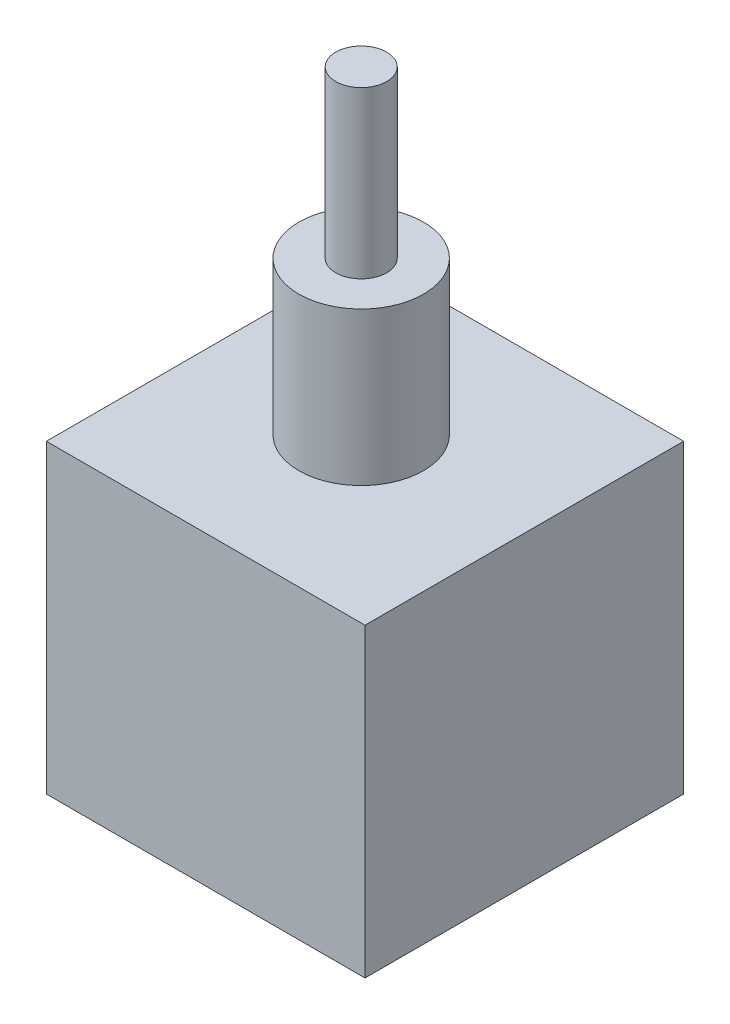
ISO-10303-21;
HEADER;
FILE_DESCRIPTION(('STEP AP214'),'2;1');
FILE_NAME('part.step','',(''),(''),'','','');
FILE_SCHEMA(('AUTOMOTIVE_DESIGN { 1 0 10303 214 1 1 1 1 }'));
ENDSEC;
DATA;
#1=APPLICATION_CONTEXT('core data for automotive mechanical design processes');
#2=APPLICATION_PROTOCOL_DEFINITION('international standard','automotive_design',2000,#1);
#3=PRODUCT_CONTEXT('',#1,'mechanical');
#4=PRODUCT('Part','Part','',(#3));
#5=PRODUCT_RELATED_PRODUCT_CATEGORY('part','',(#4));
#6=PRODUCT_DEFINITION_FORMATION('','',#4);
#7=PRODUCT_DEFINITION_CONTEXT('part definition',#1,'design');
#8=PRODUCT_DEFINITION('design','',#6,#7);
#9=PRODUCT_DEFINITION_SHAPE('','',#8);
#10=(LENGTH_UNIT() NAMED_UNIT(*) SI_UNIT(.MILLI.,.METRE.));
#11=(NAMED_UNIT(*) PLANE_ANGLE_UNIT() SI_UNIT($,.RADIAN.));
#12=(NAMED_UNIT(*) SI_UNIT($,.STERADIAN.) SOLID_ANGLE_UNIT());
#13=UNCERTAINTY_MEASURE_WITH_UNIT(LENGTH_MEASURE(1.E-05),#10,'distance_accuracy_value','');
#14=(GEOMETRIC_REPRESENTATION_CONTEXT(3) GLOBAL_UNCERTAINTY_ASSIGNED_CONTEXT((#13)) GLOBAL_UNIT_ASSIGNED_CONTEXT((#10,
#11,#12)) REPRESENTATION_CONTEXT('',''));
#15=CARTESIAN_POINT('',(0.,0.,0.));
#16=DIRECTION('',(0.,0.,1.));
#17=DIRECTION('',(1.,0.,0.));
#18=AXIS2_PLACEMENT_3D('',#15,#16,#17);
#19=CARTESIAN_POINT('',(0.,0.,0.));
#20=DIRECTION('',(0.,1.,0.));
#21=DIRECTION('',(0.,0.,1.));
#22=AXIS2_PLACEMENT_3D('',#19,#20,#21);
#23=PLANE('',#22);
#24=DIRECTION('',(0.,0.,1.));
#25=VECTOR('',#24,1.);
#26=CARTESIAN_POINT('',(-14.2865305436927,0.,-14.6432652718463));
#27=LINE('',#26,#25);
#28=CARTESIAN_POINT('',(-14.2865305436927,0.,-14.6432652718463));
#29=VERTEX_POINT('',#28);
#30=CARTESIAN_POINT('',(-14.2865305436927,0.,15.3567347281537));
#31=VERTEX_POINT('',#30);
#32=EDGE_CURVE('E118',#29,#31,#27,.T.);
#33=ORIENTED_EDGE('',*,*,#32,.F.);
#34=DIRECTION('',(-1.,0.,0.));
#35=VECTOR('',#34,1.);
#36=CARTESIAN_POINT('',(-14.2865305436927,0.,-14.6432652718463));
#37=LINE('',#36,#35);
#38=CARTESIAN_POINT('',(15.7134694563073,0.,-14.6432652718463));
#39=VERTEX_POINT('',#38);
#40=EDGE_CURVE('E88',#39,#29,#37,.T.);
#41=ORIENTED_EDGE('',*,*,#40,.F.);
#42=DIRECTION('',(0.,0.,-1.));
#43=VECTOR('',#42,1.);
#44=CARTESIAN_POINT('',(15.7134694563073,0.,-14.6432652718463));
#45=LINE('',#44,#43);
#46=CARTESIAN_POINT('',(15.7134694563073,0.,15.3567347281537));
#47=VERTEX_POINT('',#46);
#48=EDGE_CURVE('E82',#47,#39,#45,.T.);
#49=ORIENTED_EDGE('',*,*,#48,.F.);
#50=DIRECTION('',(1.,0.,0.));
#51=VECTOR('',#50,1.);
#52=CARTESIAN_POINT('',(-14.2865305436927,0.,15.3567347281537));
#53=LINE('',#52,#51);
#54=EDGE_CURVE('E107',#31,#47,#53,.T.);
#55=ORIENTED_EDGE('',*,*,#54,.F.);
#56=EDGE_LOOP('',(#33,#41,#49,#55));
#57=FACE_BOUND('',#56,.T.);
#58=CARTESIAN_POINT('',(-8.,0.,0.));
#59=DIRECTION('',(0.,1.,0.));
#60=DIRECTION('',(0.,0.,1.));
#61=AXIS2_PLACEMENT_3D('',#58,#59,#60);
#62=CIRCLE('',#61,2.5);
#63=CARTESIAN_POINT('',(-8.,0.,2.5));
#64=VERTEX_POINT('',#63);
#65=EDGE_CURVE('E154',#64,#64,#62,.T.);
#66=ORIENTED_EDGE('',*,*,#65,.T.);
#67=EDGE_LOOP('',(#66));
#68=FACE_BOUND('',#67,.T.);
#69=CARTESIAN_POINT('',(8.,0.,0.));
#70=DIRECTION('',(0.,-1.,0.));
#71=DIRECTION('',(0.,0.,-1.));
#72=AXIS2_PLACEMENT_3D('',#69,#70,#71);
#73=CIRCLE('',#72,2.5);
#74=CARTESIAN_POINT('',(8.,0.,-2.5));
#75=VERTEX_POINT('',#74);
#76=EDGE_CURVE('E158',#75,#75,#73,.T.);
#77=ORIENTED_EDGE('',*,*,#76,.F.);
#78=EDGE_LOOP('',(#77));
#79=FACE_BOUND('',#78,.T.);
#80=ADVANCED_FACE('F45',(#57,#68,#79),#23,.F.);
#81=CARTESIAN_POINT('',(-14.2865305436927,28.77,-14.6432652718463));
#82=DIRECTION('',(1.,0.,0.));
#83=DIRECTION('',(0.,0.,-1.));
#84=AXIS2_PLACEMENT_3D('',#81,#82,#83);
#85=PLANE('',#84);
#86=ORIENTED_EDGE('',*,*,#32,.T.);
#87=DIRECTION('',(0.,-1.,0.));
#88=VECTOR('',#87,1.);
#89=CARTESIAN_POINT('',(-14.2865305436927,28.77,15.3567347281537));
#90=LINE('',#89,#88);
#91=CARTESIAN_POINT('',(-14.2865305436927,28.77,15.3567347281537));
#92=VERTEX_POINT('',#91);
#93=EDGE_CURVE('E49',#92,#31,#90,.T.);
#94=ORIENTED_EDGE('',*,*,#93,.F.);
#95=DIRECTION('',(0.,0.,1.));
#96=VECTOR('',#95,1.);
#97=CARTESIAN_POINT('',(-14.2865305436927,28.77,-14.6432652718463));
#98=LINE('',#97,#96);
#99=CARTESIAN_POINT('',(-14.2865305436927,28.77,-14.6432652718463));
#100=VERTEX_POINT('',#99);
#101=EDGE_CURVE('E101',#100,#92,#98,.T.);
#102=ORIENTED_EDGE('',*,*,#101,.F.);
#103=DIRECTION('',(0.,-1.,0.));
#104=VECTOR('',#103,1.);
#105=CARTESIAN_POINT('',(-14.2865305436927,28.77,-14.6432652718463));
#106=LINE('',#105,#104);
#107=EDGE_CURVE('E114',#100,#29,#106,.T.);
#108=ORIENTED_EDGE('',*,*,#107,.T.);
#109=EDGE_LOOP('',(#86,#94,#102,#108));
#110=FACE_BOUND('',#109,.T.);
#111=ADVANCED_FACE('F47',(#110),#85,.F.);
#112=CARTESIAN_POINT('',(-14.2865305436927,28.77,15.3567347281537));
#113=DIRECTION('',(0.,0.,-1.));
#114=DIRECTION('',(-1.,0.,0.));
#115=AXIS2_PLACEMENT_3D('',#112,#113,#114);
#116=PLANE('',#115);
#117=ORIENTED_EDGE('',*,*,#54,.T.);
#118=DIRECTION('',(0.,-1.,0.));
#119=VECTOR('',#118,1.);
#120=CARTESIAN_POINT('',(15.7134694563073,28.77,15.3567347281537));
#121=LINE('',#120,#119);
#122=CARTESIAN_POINT('',(15.7134694563073,28.77,15.3567347281537));
#123=VERTEX_POINT('',#122);
#124=EDGE_CURVE('E105',#123,#47,#121,.T.);
#125=ORIENTED_EDGE('',*,*,#124,.F.);
#126=DIRECTION('',(1.,0.,0.));
#127=VECTOR('',#126,1.);
#128=CARTESIAN_POINT('',(-14.2865305436927,28.77,15.3567347281537));
#129=LINE('',#128,#127);
#130=EDGE_CURVE('E96',#92,#123,#129,.T.);
#131=ORIENTED_EDGE('',*,*,#130,.F.);
#132=ORIENTED_EDGE('',*,*,#93,.T.);
#133=EDGE_LOOP('',(#117,#125,#131,#132));
#134=FACE_BOUND('',#133,.T.);
#135=ADVANCED_FACE('F106',(#134),#116,.F.);
#136=CARTESIAN_POINT('',(15.7134694563073,28.77,-14.6432652718463));
#137=DIRECTION('',(-1.,0.,0.));
#138=DIRECTION('',(0.,0.,1.));
#139=AXIS2_PLACEMENT_3D('',#136,#137,#138);
#140=PLANE('',#139);
#141=ORIENTED_EDGE('',*,*,#48,.T.);
#142=DIRECTION('',(0.,-1.,0.));
#143=VECTOR('',#142,1.);
#144=CARTESIAN_POINT('',(15.7134694563073,28.77,-14.6432652718463));
#145=LINE('',#144,#143);
#146=CARTESIAN_POINT('',(15.7134694563073,28.77,-14.6432652718463));
#147=VERTEX_POINT('',#146);
#148=EDGE_CURVE('E109',#147,#39,#145,.T.);
#149=ORIENTED_EDGE('',*,*,#148,.F.);
#150=DIRECTION('',(0.,0.,-1.));
#151=VECTOR('',#150,1.);
#152=CARTESIAN_POINT('',(15.7134694563073,28.77,-14.6432652718463));
#153=LINE('',#152,#151);
#154=EDGE_CURVE('E99',#123,#147,#153,.T.);
#155=ORIENTED_EDGE('',*,*,#154,.F.);
#156=ORIENTED_EDGE('',*,*,#124,.T.);
#157=EDGE_LOOP('',(#141,#149,#155,#156));
#158=FACE_BOUND('',#157,.T.);
#159=ADVANCED_FACE('F110',(#158),#140,.F.);
#160=CARTESIAN_POINT('',(-14.2865305436927,28.77,-14.6432652718463));
#161=DIRECTION('',(0.,0.,1.));
#162=DIRECTION('',(1.,0.,0.));
#163=AXIS2_PLACEMENT_3D('',#160,#161,#162);
#164=PLANE('',#163);
#165=ORIENTED_EDGE('',*,*,#40,.T.);
#166=ORIENTED_EDGE('',*,*,#107,.F.);
#167=DIRECTION('',(-1.,0.,0.));
#168=VECTOR('',#167,1.);
#169=CARTESIAN_POINT('',(-14.2865305436927,28.77,-14.6432652718463));
#170=LINE('',#169,#168);
#171=EDGE_CURVE('E65',#147,#100,#170,.T.);
#172=ORIENTED_EDGE('',*,*,#171,.F.);
#173=ORIENTED_EDGE('',*,*,#148,.T.);
#174=EDGE_LOOP('',(#165,#166,#172,#173));
#175=FACE_BOUND('',#174,.T.);
#176=ADVANCED_FACE('F132',(#175),#164,.F.);
#177=CARTESIAN_POINT('',(0.,28.77,0.));
#178=DIRECTION('',(0.,1.,0.));
#179=DIRECTION('',(0.,0.,1.));
#180=AXIS2_PLACEMENT_3D('',#177,#178,#179);
#181=PLANE('',#180);
#182=CARTESIAN_POINT('',(0.,28.77,0.));
#183=DIRECTION('',(0.,1.,0.));
#184=DIRECTION('',(0.,0.,1.));
#185=AXIS2_PLACEMENT_3D('',#182,#183,#184);
#186=CIRCLE('',#185,5.875);
#187=CARTESIAN_POINT('',(0.,28.77,5.875));
#188=VERTEX_POINT('',#187);
#189=EDGE_CURVE('E56',#188,#188,#186,.T.);
#190=ORIENTED_EDGE('',*,*,#189,.F.);
#191=EDGE_LOOP('',(#190));
#192=FACE_BOUND('',#191,.T.);
#193=ORIENTED_EDGE('',*,*,#101,.T.);
#194=ORIENTED_EDGE('',*,*,#130,.T.);
#195=ORIENTED_EDGE('',*,*,#154,.T.);
#196=ORIENTED_EDGE('',*,*,#171,.T.);
#197=EDGE_LOOP('',(#193,#194,#195,#196));
#198=FACE_BOUND('',#197,.T.);
#199=ADVANCED_FACE('F97',(#192,#198),#181,.T.);
#200=CARTESIAN_POINT('',(0.,43.17,0.));
#201=DIRECTION('',(0.,-1.,0.));
#202=DIRECTION('',(0.,0.,-1.));
#203=AXIS2_PLACEMENT_3D('',#200,#201,#202);
#204=CYLINDRICAL_SURFACE('',#203,5.875);
#205=CARTESIAN_POINT('',(0.,43.17,0.));
#206=DIRECTION('',(0.,1.,0.));
#207=DIRECTION('',(0.,0.,1.));
#208=AXIS2_PLACEMENT_3D('',#205,#206,#207);
#209=CIRCLE('',#208,5.875);
#210=CARTESIAN_POINT('',(0.,43.17,5.875));
#211=VERTEX_POINT('',#210);
#212=EDGE_CURVE('E122',#211,#211,#209,.T.);
#213=ORIENTED_EDGE('',*,*,#212,.F.);
#214=EDGE_LOOP('',(#213));
#215=FACE_BOUND('',#214,.T.);
#216=ORIENTED_EDGE('',*,*,#189,.T.);
#217=EDGE_LOOP('',(#216));
#218=FACE_BOUND('',#217,.T.);
#219=ADVANCED_FACE('F210',(#215,#218),#204,.T.);
#220=CARTESIAN_POINT('',(0.,43.17,0.));
#221=DIRECTION('',(0.,1.,0.));
#222=DIRECTION('',(0.,0.,1.));
#223=AXIS2_PLACEMENT_3D('',#220,#221,#222);
#224=PLANE('',#223);
#225=CARTESIAN_POINT('',(0.,43.17,0.));
#226=DIRECTION('',(0.,1.,0.));
#227=DIRECTION('',(0.,0.,1.));
#228=AXIS2_PLACEMENT_3D('',#225,#226,#227);
#229=CIRCLE('',#228,2.4);
#230=CARTESIAN_POINT('',(0.,43.17,2.4));
#231=VERTEX_POINT('',#230);
#232=EDGE_CURVE('E11',#231,#231,#229,.T.);
#233=ORIENTED_EDGE('',*,*,#232,.F.);
#234=EDGE_LOOP('',(#233));
#235=FACE_BOUND('',#234,.T.);
#236=ORIENTED_EDGE('',*,*,#212,.T.);
#237=EDGE_LOOP('',(#236));
#238=FACE_BOUND('',#237,.T.);
#239=ADVANCED_FACE('F218',(#235,#238),#224,.T.);
#240=CARTESIAN_POINT('',(0.,58.77,0.));
#241=DIRECTION('',(0.,-1.,0.));
#242=DIRECTION('',(0.,0.,-1.));
#243=AXIS2_PLACEMENT_3D('',#240,#241,#242);
#244=CYLINDRICAL_SURFACE('',#243,2.4);
#245=CARTESIAN_POINT('',(0.,58.77,0.));
#246=DIRECTION('',(0.,1.,0.));
#247=DIRECTION('',(0.,0.,1.));
#248=AXIS2_PLACEMENT_3D('',#245,#246,#247);
#249=CIRCLE('',#248,2.4);
#250=CARTESIAN_POINT('',(0.,58.77,2.4));
#251=VERTEX_POINT('',#250);
#252=EDGE_CURVE('E144',#251,#251,#249,.T.);
#253=ORIENTED_EDGE('',*,*,#252,.F.);
#254=EDGE_LOOP('',(#253));
#255=FACE_BOUND('',#254,.T.);
#256=ORIENTED_EDGE('',*,*,#232,.T.);
#257=EDGE_LOOP('',(#256));
#258=FACE_BOUND('',#257,.T.);
#259=ADVANCED_FACE('F226',(#255,#258),#244,.T.);
#260=CARTESIAN_POINT('',(0.,58.77,0.));
#261=DIRECTION('',(0.,1.,0.));
#262=DIRECTION('',(0.,0.,1.));
#263=AXIS2_PLACEMENT_3D('',#260,#261,#262);
#264=PLANE('',#263);
#265=ORIENTED_EDGE('',*,*,#252,.T.);
#266=EDGE_LOOP('',(#265));
#267=FACE_BOUND('',#266,.T.);
#268=ADVANCED_FACE('F234',(#267),#264,.T.);
#269=CARTESIAN_POINT('',(-8.,15.,0.));
#270=DIRECTION('',(0.,-1.,0.));
#271=DIRECTION('',(0.,0.,-1.));
#272=AXIS2_PLACEMENT_3D('',#269,#270,#271);
#273=CYLINDRICAL_SURFACE('',#272,2.5);
#274=CARTESIAN_POINT('',(-8.,15.,0.));
#275=DIRECTION('',(0.,1.,0.));
#276=DIRECTION('',(0.,0.,1.));
#277=AXIS2_PLACEMENT_3D('',#274,#275,#276);
#278=CIRCLE('',#277,2.5);
#279=CARTESIAN_POINT('',(-8.,15.,2.5));
#280=VERTEX_POINT('',#279);
#281=EDGE_CURVE('E150',#280,#280,#278,.T.);
#282=ORIENTED_EDGE('',*,*,#281,.T.);
#283=EDGE_LOOP('',(#282));
#284=FACE_BOUND('',#283,.T.);
#285=ORIENTED_EDGE('',*,*,#65,.F.);
#286=EDGE_LOOP('',(#285));
#287=FACE_BOUND('',#286,.T.);
#288=ADVANCED_FACE('F242',(#284,#287),#273,.F.);
#289=CARTESIAN_POINT('',(-8.,15.,0.));
#290=DIRECTION('',(0.,1.,0.));
#291=DIRECTION('',(0.,0.,1.));
#292=AXIS2_PLACEMENT_3D('',#289,#290,#291);
#293=PLANE('',#292);
#294=ORIENTED_EDGE('',*,*,#281,.F.);
#295=EDGE_LOOP('',(#294));
#296=FACE_BOUND('',#295,.T.);
#297=ADVANCED_FACE('F171',(#296),#293,.F.);
#298=CARTESIAN_POINT('',(8.,15.,0.));
#299=DIRECTION('',(0.,-1.,0.));
#300=DIRECTION('',(0.,0.,-1.));
#301=AXIS2_PLACEMENT_3D('',#298,#299,#300);
#302=CYLINDRICAL_SURFACE('',#301,2.5);
#303=CARTESIAN_POINT('',(8.,15.,0.));
#304=DIRECTION('',(0.,-1.,0.));
#305=DIRECTION('',(0.,0.,-1.));
#306=AXIS2_PLACEMENT_3D('',#303,#304,#305);
#307=CIRCLE('',#306,2.5);
#308=CARTESIAN_POINT('',(8.,15.,-2.5));
#309=VERTEX_POINT('',#308);
#310=EDGE_CURVE('E149',#309,#309,#307,.T.);
#311=ORIENTED_EDGE('',*,*,#310,.F.);
#312=EDGE_LOOP('',(#311));
#313=FACE_BOUND('',#312,.T.);
#314=ORIENTED_EDGE('',*,*,#76,.T.);
#315=EDGE_LOOP('',(#314));
#316=FACE_BOUND('',#315,.T.);
#317=ADVANCED_FACE('F168',(#313,#316),#302,.F.);
#318=CARTESIAN_POINT('',(0.,15.,0.));
#319=DIRECTION('',(0.,-1.,0.));
#320=DIRECTION('',(0.,0.,-1.));
#321=AXIS2_PLACEMENT_3D('',#318,#319,#320);
#322=PLANE('',#321);
#323=ORIENTED_EDGE('',*,*,#310,.T.);
#324=EDGE_LOOP('',(#323));
#325=FACE_BOUND('',#324,.T.);
#326=ADVANCED_FACE('F166',(#325),#322,.T.);
#327=CLOSED_SHELL('',(#80,#111,#135,#159,#176,#199,#219,#239,#259,#268,#288,#297,#317,#326));
#328=MANIFOLD_SOLID_BREP('B2',#327);
#329=ADVANCED_BREP_SHAPE_REPRESENTATION('',(#18,#328),#14);
#330=SHAPE_DEFINITION_REPRESENTATION(#9,#329);
ENDSEC;
END-ISO-10303-21;
